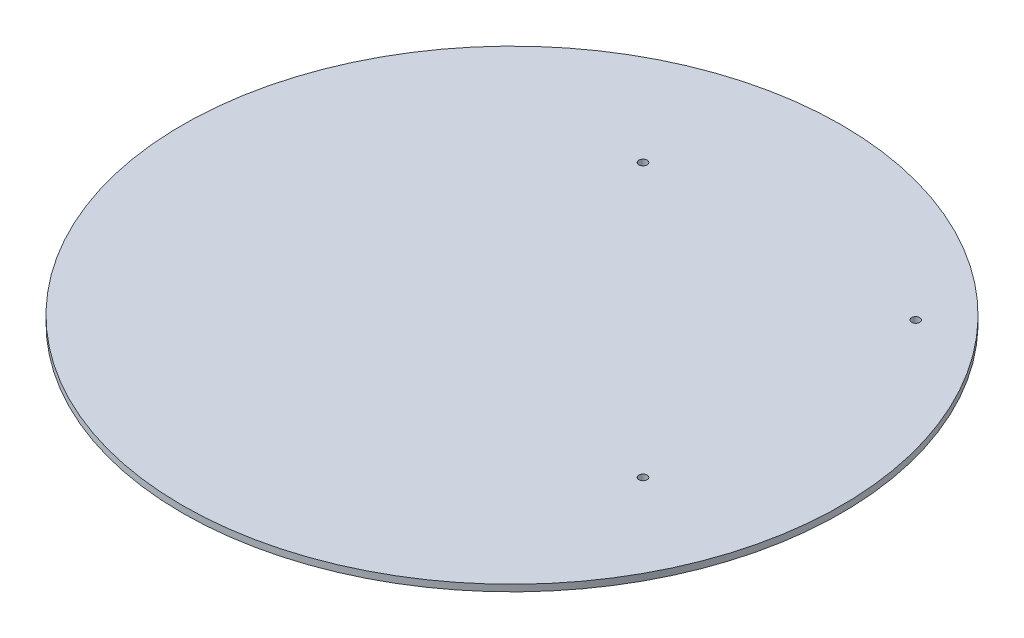
ISO-10303-21;
HEADER;
FILE_DESCRIPTION(('STEP AP214'),'2;1');
FILE_NAME('part.step','',(''),(''),'','','');
FILE_SCHEMA(('AUTOMOTIVE_DESIGN { 1 0 10303 214 1 1 1 1 }'));
ENDSEC;
DATA;
#1=APPLICATION_CONTEXT('core data for automotive mechanical design processes');
#2=APPLICATION_PROTOCOL_DEFINITION('international standard','automotive_design',2000,#1);
#3=PRODUCT_CONTEXT('',#1,'mechanical');
#4=PRODUCT('Part','Part','',(#3));
#5=PRODUCT_RELATED_PRODUCT_CATEGORY('part','',(#4));
#6=PRODUCT_DEFINITION_FORMATION('','',#4);
#7=PRODUCT_DEFINITION_CONTEXT('part definition',#1,'design');
#8=PRODUCT_DEFINITION('design','',#6,#7);
#9=PRODUCT_DEFINITION_SHAPE('','',#8);
#10=(LENGTH_UNIT() NAMED_UNIT(*) SI_UNIT(.MILLI.,.METRE.));
#11=(NAMED_UNIT(*) PLANE_ANGLE_UNIT() SI_UNIT($,.RADIAN.));
#12=(NAMED_UNIT(*) SI_UNIT($,.STERADIAN.) SOLID_ANGLE_UNIT());
#13=UNCERTAINTY_MEASURE_WITH_UNIT(LENGTH_MEASURE(1.E-05),#10,'distance_accuracy_value','');
#14=(GEOMETRIC_REPRESENTATION_CONTEXT(3) GLOBAL_UNCERTAINTY_ASSIGNED_CONTEXT((#13)) GLOBAL_UNIT_ASSIGNED_CONTEXT((#10,
#11,#12)) REPRESENTATION_CONTEXT('',''));
#15=CARTESIAN_POINT('',(0.,0.,0.));
#16=DIRECTION('',(0.,0.,1.));
#17=DIRECTION('',(1.,0.,0.));
#18=AXIS2_PLACEMENT_3D('',#15,#16,#17);
#19=CARTESIAN_POINT('',(0.,4.,0.));
#20=DIRECTION('',(0.,1.,0.));
#21=DIRECTION('',(0.,0.,1.));
#22=AXIS2_PLACEMENT_3D('',#19,#20,#21);
#23=PLANE('',#22);
#24=CARTESIAN_POINT('',(125.,4.,-120.));
#25=DIRECTION('',(0.,1.,0.));
#26=DIRECTION('',(0.,0.,1.));
#27=AXIS2_PLACEMENT_3D('',#24,#25,#26);
#28=CIRCLE('',#27,2.49999999999997);
#29=CARTESIAN_POINT('',(125.,4.,-117.5));
#30=VERTEX_POINT('',#29);
#31=EDGE_CURVE('E88',#30,#30,#28,.T.);
#32=ORIENTED_EDGE('',*,*,#31,.F.);
#33=EDGE_LOOP('',(#32));
#34=FACE_BOUND('',#33,.T.);
#35=CARTESIAN_POINT('',(0.,4.,0.));
#36=DIRECTION('',(0.,1.,0.));
#37=DIRECTION('',(0.,0.,1.));
#38=AXIS2_PLACEMENT_3D('',#35,#36,#37);
#39=CIRCLE('',#38,200.);
#40=CARTESIAN_POINT('',(0.,4.,200.));
#41=VERTEX_POINT('',#40);
#42=EDGE_CURVE('E13',#41,#41,#39,.T.);
#43=ORIENTED_EDGE('',*,*,#42,.T.);
#44=EDGE_LOOP('',(#43));
#45=FACE_BOUND('',#44,.T.);
#46=CARTESIAN_POINT('',(-40.5,4.,-120.));
#47=DIRECTION('',(0.,1.,0.));
#48=DIRECTION('',(0.,0.,1.));
#49=AXIS2_PLACEMENT_3D('',#46,#47,#48);
#50=CIRCLE('',#49,2.5);
#51=CARTESIAN_POINT('',(-40.5,4.,-117.5));
#52=VERTEX_POINT('',#51);
#53=EDGE_CURVE('E82',#52,#52,#50,.T.);
#54=ORIENTED_EDGE('',*,*,#53,.F.);
#55=EDGE_LOOP('',(#54));
#56=FACE_BOUND('',#55,.T.);
#57=CARTESIAN_POINT('',(125.,4.,45.5));
#58=DIRECTION('',(0.,1.,0.));
#59=DIRECTION('',(0.,0.,1.));
#60=AXIS2_PLACEMENT_3D('',#57,#58,#59);
#61=CIRCLE('',#60,2.5);
#62=CARTESIAN_POINT('',(125.,4.,48.));
#63=VERTEX_POINT('',#62);
#64=EDGE_CURVE('E96',#63,#63,#61,.T.);
#65=ORIENTED_EDGE('',*,*,#64,.F.);
#66=EDGE_LOOP('',(#65));
#67=FACE_BOUND('',#66,.T.);
#68=ADVANCED_FACE('F68',(#34,#45,#56,#67),#23,.T.);
#69=CARTESIAN_POINT('',(0.,0.,0.));
#70=DIRECTION('',(0.,1.,0.));
#71=DIRECTION('',(0.,0.,1.));
#72=AXIS2_PLACEMENT_3D('',#69,#70,#71);
#73=PLANE('',#72);
#74=CARTESIAN_POINT('',(0.,0.,0.));
#75=DIRECTION('',(0.,1.,0.));
#76=DIRECTION('',(0.,0.,1.));
#77=AXIS2_PLACEMENT_3D('',#74,#75,#76);
#78=CIRCLE('',#77,200.);
#79=CARTESIAN_POINT('',(0.,0.,200.));
#80=VERTEX_POINT('',#79);
#81=EDGE_CURVE('E72',#80,#80,#78,.T.);
#82=ORIENTED_EDGE('',*,*,#81,.F.);
#83=EDGE_LOOP('',(#82));
#84=FACE_BOUND('',#83,.T.);
#85=CARTESIAN_POINT('',(-40.5,0.,-120.));
#86=DIRECTION('',(0.,1.,0.));
#87=DIRECTION('',(0.,0.,1.));
#88=AXIS2_PLACEMENT_3D('',#85,#86,#87);
#89=CIRCLE('',#88,2.5);
#90=CARTESIAN_POINT('',(-40.5,0.,-117.5));
#91=VERTEX_POINT('',#90);
#92=EDGE_CURVE('E84',#91,#91,#89,.T.);
#93=ORIENTED_EDGE('',*,*,#92,.T.);
#94=EDGE_LOOP('',(#93));
#95=FACE_BOUND('',#94,.T.);
#96=CARTESIAN_POINT('',(125.,0.,-120.));
#97=DIRECTION('',(0.,1.,0.));
#98=DIRECTION('',(0.,0.,1.));
#99=AXIS2_PLACEMENT_3D('',#96,#97,#98);
#100=CIRCLE('',#99,2.49999999999997);
#101=CARTESIAN_POINT('',(125.,0.,-117.5));
#102=VERTEX_POINT('',#101);
#103=EDGE_CURVE('E92',#102,#102,#100,.T.);
#104=ORIENTED_EDGE('',*,*,#103,.T.);
#105=EDGE_LOOP('',(#104));
#106=FACE_BOUND('',#105,.T.);
#107=CARTESIAN_POINT('',(125.,0.,45.5));
#108=DIRECTION('',(0.,1.,0.));
#109=DIRECTION('',(0.,0.,1.));
#110=AXIS2_PLACEMENT_3D('',#107,#108,#109);
#111=CIRCLE('',#110,2.5);
#112=CARTESIAN_POINT('',(125.,0.,48.));
#113=VERTEX_POINT('',#112);
#114=EDGE_CURVE('E100',#113,#113,#111,.T.);
#115=ORIENTED_EDGE('',*,*,#114,.T.);
#116=EDGE_LOOP('',(#115));
#117=FACE_BOUND('',#116,.T.);
#118=ADVANCED_FACE('F113',(#84,#95,#106,#117),#73,.F.);
#119=CARTESIAN_POINT('',(0.,4.,0.));
#120=DIRECTION('',(0.,-1.,0.));
#121=DIRECTION('',(0.,0.,-1.));
#122=AXIS2_PLACEMENT_3D('',#119,#120,#121);
#123=CYLINDRICAL_SURFACE('',#122,200.);
#124=ORIENTED_EDGE('',*,*,#42,.F.);
#125=EDGE_LOOP('',(#124));
#126=FACE_BOUND('',#125,.T.);
#127=ORIENTED_EDGE('',*,*,#81,.T.);
#128=EDGE_LOOP('',(#127));
#129=FACE_BOUND('',#128,.T.);
#130=ADVANCED_FACE('F70',(#126,#129),#123,.T.);
#131=CARTESIAN_POINT('',(-40.5,4.,-120.));
#132=DIRECTION('',(0.,-1.,0.));
#133=DIRECTION('',(0.,0.,-1.));
#134=AXIS2_PLACEMENT_3D('',#131,#132,#133);
#135=CYLINDRICAL_SURFACE('',#134,2.5);
#136=ORIENTED_EDGE('',*,*,#53,.T.);
#137=EDGE_LOOP('',(#136));
#138=FACE_BOUND('',#137,.T.);
#139=ORIENTED_EDGE('',*,*,#92,.F.);
#140=EDGE_LOOP('',(#139));
#141=FACE_BOUND('',#140,.T.);
#142=ADVANCED_FACE('F122',(#138,#141),#135,.F.);
#143=CARTESIAN_POINT('',(125.,4.,-120.));
#144=DIRECTION('',(0.,-1.,0.));
#145=DIRECTION('',(0.,0.,-1.));
#146=AXIS2_PLACEMENT_3D('',#143,#144,#145);
#147=CYLINDRICAL_SURFACE('',#146,2.49999999999997);
#148=ORIENTED_EDGE('',*,*,#31,.T.);
#149=EDGE_LOOP('',(#148));
#150=FACE_BOUND('',#149,.T.);
#151=ORIENTED_EDGE('',*,*,#103,.F.);
#152=EDGE_LOOP('',(#151));
#153=FACE_BOUND('',#152,.T.);
#154=ADVANCED_FACE('F125',(#150,#153),#147,.F.);
#155=CARTESIAN_POINT('',(125.,4.,45.5));
#156=DIRECTION('',(0.,-1.,0.));
#157=DIRECTION('',(0.,0.,-1.));
#158=AXIS2_PLACEMENT_3D('',#155,#156,#157);
#159=CYLINDRICAL_SURFACE('',#158,2.5);
#160=ORIENTED_EDGE('',*,*,#64,.T.);
#161=EDGE_LOOP('',(#160));
#162=FACE_BOUND('',#161,.T.);
#163=ORIENTED_EDGE('',*,*,#114,.F.);
#164=EDGE_LOOP('',(#163));
#165=FACE_BOUND('',#164,.T.);
#166=ADVANCED_FACE('F109',(#162,#165),#159,.F.);
#167=CLOSED_SHELL('',(#68,#118,#130,#142,#154,#166));
#168=MANIFOLD_SOLID_BREP('B2',#167);
#169=ADVANCED_BREP_SHAPE_REPRESENTATION('',(#18,#168),#14);
#170=SHAPE_DEFINITION_REPRESENTATION(#9,#169);
ENDSEC;
END-ISO-10303-21;
